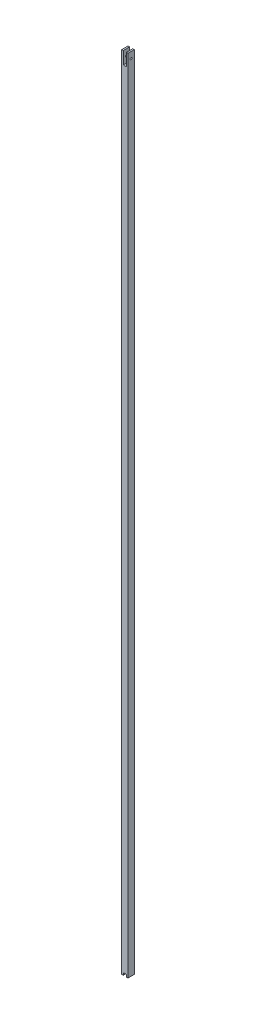
ISO-10303-21;
HEADER;
FILE_DESCRIPTION(('STEP AP214'),'2;1');
FILE_NAME('part.step','',(''),(''),'','','');
FILE_SCHEMA(('AUTOMOTIVE_DESIGN { 1 0 10303 214 1 1 1 1 }'));
ENDSEC;
DATA;
#1=APPLICATION_CONTEXT('core data for automotive mechanical design processes');
#2=APPLICATION_PROTOCOL_DEFINITION('international standard','automotive_design',2000,#1);
#3=PRODUCT_CONTEXT('',#1,'mechanical');
#4=PRODUCT('Part','Part','',(#3));
#5=PRODUCT_RELATED_PRODUCT_CATEGORY('part','',(#4));
#6=PRODUCT_DEFINITION_FORMATION('','',#4);
#7=PRODUCT_DEFINITION_CONTEXT('part definition',#1,'design');
#8=PRODUCT_DEFINITION('design','',#6,#7);
#9=PRODUCT_DEFINITION_SHAPE('','',#8);
#10=(LENGTH_UNIT() NAMED_UNIT(*) SI_UNIT(.MILLI.,.METRE.));
#11=(NAMED_UNIT(*) PLANE_ANGLE_UNIT() SI_UNIT($,.RADIAN.));
#12=(NAMED_UNIT(*) SI_UNIT($,.STERADIAN.) SOLID_ANGLE_UNIT());
#13=UNCERTAINTY_MEASURE_WITH_UNIT(LENGTH_MEASURE(1.E-05),#10,'distance_accuracy_value','');
#14=(GEOMETRIC_REPRESENTATION_CONTEXT(3) GLOBAL_UNCERTAINTY_ASSIGNED_CONTEXT((#13)) GLOBAL_UNIT_ASSIGNED_CONTEXT((#10,
#11,#12)) REPRESENTATION_CONTEXT('',''));
#15=CARTESIAN_POINT('',(0.,0.,0.));
#16=DIRECTION('',(0.,0.,1.));
#17=DIRECTION('',(1.,0.,0.));
#18=AXIS2_PLACEMENT_3D('',#15,#16,#17);
#19=CARTESIAN_POINT('',(0.,812.8,6.35));
#20=DIRECTION('',(1.,0.,0.));
#21=DIRECTION('',(0.,0.,-1.));
#22=AXIS2_PLACEMENT_3D('',#19,#20,#21);
#23=PLANE('',#22);
#24=CARTESIAN_POINT('',(0.,806.45,3.175));
#25=DIRECTION('',(1.,0.,0.));
#26=DIRECTION('',(0.,0.,-1.));
#27=AXIS2_PLACEMENT_3D('',#24,#25,#26);
#28=CIRCLE('',#27,1.);
#29=CARTESIAN_POINT('',(0.,806.45,2.175));
#30=VERTEX_POINT('',#29);
#31=EDGE_CURVE('E167',#30,#30,#28,.T.);
#32=ORIENTED_EDGE('',*,*,#31,.T.);
#33=EDGE_LOOP('',(#32));
#34=FACE_BOUND('',#33,.T.);
#35=DIRECTION('',(0.,-1.,0.));
#36=VECTOR('',#35,1.);
#37=CARTESIAN_POINT('',(0.,812.8,0.));
#38=LINE('',#37,#36);
#39=CARTESIAN_POINT('',(0.,812.8,0.));
#40=VERTEX_POINT('',#39);
#41=CARTESIAN_POINT('',(0.,0.,0.));
#42=VERTEX_POINT('',#41);
#43=EDGE_CURVE('E165',#40,#42,#38,.T.);
#44=ORIENTED_EDGE('',*,*,#43,.T.);
#45=DIRECTION('',(0.,0.,-1.));
#46=VECTOR('',#45,1.);
#47=CARTESIAN_POINT('',(0.,0.,6.35));
#48=LINE('',#47,#46);
#49=CARTESIAN_POINT('',(0.,0.,6.35));
#50=VERTEX_POINT('',#49);
#51=EDGE_CURVE('E11',#50,#42,#48,.T.);
#52=ORIENTED_EDGE('',*,*,#51,.F.);
#53=DIRECTION('',(0.,-1.,0.));
#54=VECTOR('',#53,1.);
#55=CARTESIAN_POINT('',(0.,812.8,6.35));
#56=LINE('',#55,#54);
#57=CARTESIAN_POINT('',(0.,812.8,6.35));
#58=VERTEX_POINT('',#57);
#59=EDGE_CURVE('E183',#58,#50,#56,.T.);
#60=ORIENTED_EDGE('',*,*,#59,.F.);
#61=DIRECTION('',(0.,0.,-1.));
#62=VECTOR('',#61,1.);
#63=CARTESIAN_POINT('',(0.,812.8,6.35));
#64=LINE('',#63,#62);
#65=EDGE_CURVE('E158',#58,#40,#64,.T.);
#66=ORIENTED_EDGE('',*,*,#65,.T.);
#67=EDGE_LOOP('',(#44,#52,#60,#66));
#68=FACE_BOUND('',#67,.T.);
#69=ADVANCED_FACE('F41',(#34,#68),#23,.F.);
#70=CARTESIAN_POINT('',(0.,0.,6.35));
#71=DIRECTION('',(0.,1.,0.));
#72=DIRECTION('',(0.,0.,1.));
#73=AXIS2_PLACEMENT_3D('',#70,#71,#72);
#74=PLANE('',#73);
#75=DIRECTION('',(1.,0.,0.));
#76=VECTOR('',#75,1.);
#77=CARTESIAN_POINT('',(0.,0.,0.));
#78=LINE('',#77,#76);
#79=CARTESIAN_POINT('',(1.5875,0.,0.));
#80=VERTEX_POINT('',#79);
#81=EDGE_CURVE('E164',#42,#80,#78,.T.);
#82=ORIENTED_EDGE('',*,*,#81,.T.);
#83=DIRECTION('',(0.,0.,-1.));
#84=VECTOR('',#83,1.);
#85=CARTESIAN_POINT('',(1.5875,0.,6.35));
#86=LINE('',#85,#84);
#87=CARTESIAN_POINT('',(1.5875,0.,6.35));
#88=VERTEX_POINT('',#87);
#89=EDGE_CURVE('E49',#88,#80,#86,.T.);
#90=ORIENTED_EDGE('',*,*,#89,.F.);
#91=DIRECTION('',(1.,0.,0.));
#92=VECTOR('',#91,1.);
#93=CARTESIAN_POINT('',(0.,0.,6.35));
#94=LINE('',#93,#92);
#95=EDGE_CURVE('E114',#50,#88,#94,.T.);
#96=ORIENTED_EDGE('',*,*,#95,.F.);
#97=ORIENTED_EDGE('',*,*,#51,.T.);
#98=EDGE_LOOP('',(#82,#90,#96,#97));
#99=FACE_BOUND('',#98,.T.);
#100=ADVANCED_FACE('F266',(#99),#74,.F.);
#101=CARTESIAN_POINT('',(1.5875,0.,6.35));
#102=DIRECTION('',(-1.,0.,0.));
#103=DIRECTION('',(0.,0.,1.));
#104=AXIS2_PLACEMENT_3D('',#101,#102,#103);
#105=PLANE('',#104);
#106=DIRECTION('',(0.,1.,0.));
#107=VECTOR('',#106,1.);
#108=CARTESIAN_POINT('',(1.5875,0.,0.));
#109=LINE('',#108,#107);
#110=CARTESIAN_POINT('',(1.5875,2.38125,0.));
#111=VERTEX_POINT('',#110);
#112=EDGE_CURVE('E169',#80,#111,#109,.T.);
#113=ORIENTED_EDGE('',*,*,#112,.T.);
#114=DIRECTION('',(0.,0.,-1.));
#115=VECTOR('',#114,1.);
#116=CARTESIAN_POINT('',(1.5875,2.38125,6.35));
#117=LINE('',#116,#115);
#118=CARTESIAN_POINT('',(1.5875,2.38125,6.35));
#119=VERTEX_POINT('',#118);
#120=EDGE_CURVE('E204',#119,#111,#117,.T.);
#121=ORIENTED_EDGE('',*,*,#120,.F.);
#122=DIRECTION('',(0.,1.,0.));
#123=VECTOR('',#122,1.);
#124=CARTESIAN_POINT('',(1.5875,0.,6.35));
#125=LINE('',#124,#123);
#126=EDGE_CURVE('E213',#88,#119,#125,.T.);
#127=ORIENTED_EDGE('',*,*,#126,.F.);
#128=ORIENTED_EDGE('',*,*,#89,.T.);
#129=EDGE_LOOP('',(#113,#121,#127,#128));
#130=FACE_BOUND('',#129,.T.);
#131=ADVANCED_FACE('F211',(#130),#105,.F.);
#132=CARTESIAN_POINT('',(1.5875,2.38125,6.35));
#133=DIRECTION('',(0.,1.,0.));
#134=DIRECTION('',(0.,0.,1.));
#135=AXIS2_PLACEMENT_3D('',#132,#133,#134);
#136=PLANE('',#135);
#137=DIRECTION('',(1.,0.,0.));
#138=VECTOR('',#137,1.);
#139=CARTESIAN_POINT('',(1.5875,2.38125,0.));
#140=LINE('',#139,#138);
#141=CARTESIAN_POINT('',(4.7625,2.38125,0.));
#142=VERTEX_POINT('',#141);
#143=EDGE_CURVE('E168',#111,#142,#140,.T.);
#144=ORIENTED_EDGE('',*,*,#143,.T.);
#145=DIRECTION('',(0.,0.,-1.));
#146=VECTOR('',#145,1.);
#147=CARTESIAN_POINT('',(4.7625,2.38125,6.35));
#148=LINE('',#147,#146);
#149=CARTESIAN_POINT('',(4.7625,2.38125,6.35));
#150=VERTEX_POINT('',#149);
#151=EDGE_CURVE('E203',#150,#142,#148,.T.);
#152=ORIENTED_EDGE('',*,*,#151,.F.);
#153=DIRECTION('',(1.,0.,0.));
#154=VECTOR('',#153,1.);
#155=CARTESIAN_POINT('',(1.5875,2.38125,6.35));
#156=LINE('',#155,#154);
#157=EDGE_CURVE('E233',#119,#150,#156,.T.);
#158=ORIENTED_EDGE('',*,*,#157,.F.);
#159=ORIENTED_EDGE('',*,*,#120,.T.);
#160=EDGE_LOOP('',(#144,#152,#158,#159));
#161=FACE_BOUND('',#160,.T.);
#162=ADVANCED_FACE('F225',(#161),#136,.F.);
#163=CARTESIAN_POINT('',(4.7625,2.38125,6.35));
#164=DIRECTION('',(1.,0.,0.));
#165=DIRECTION('',(0.,0.,-1.));
#166=AXIS2_PLACEMENT_3D('',#163,#164,#165);
#167=PLANE('',#166);
#168=DIRECTION('',(0.,-1.,0.));
#169=VECTOR('',#168,1.);
#170=CARTESIAN_POINT('',(4.7625,2.38125,0.));
#171=LINE('',#170,#169);
#172=CARTESIAN_POINT('',(4.7625,0.,0.));
#173=VERTEX_POINT('',#172);
#174=EDGE_CURVE('E174',#142,#173,#171,.T.);
#175=ORIENTED_EDGE('',*,*,#174,.T.);
#176=DIRECTION('',(0.,0.,-1.));
#177=VECTOR('',#176,1.);
#178=CARTESIAN_POINT('',(4.7625,0.,6.35));
#179=LINE('',#178,#177);
#180=CARTESIAN_POINT('',(4.7625,0.,6.35));
#181=VERTEX_POINT('',#180);
#182=EDGE_CURVE('E196',#181,#173,#179,.T.);
#183=ORIENTED_EDGE('',*,*,#182,.F.);
#184=DIRECTION('',(0.,-1.,0.));
#185=VECTOR('',#184,1.);
#186=CARTESIAN_POINT('',(4.7625,2.38125,6.35));
#187=LINE('',#186,#185);
#188=EDGE_CURVE('E227',#150,#181,#187,.T.);
#189=ORIENTED_EDGE('',*,*,#188,.F.);
#190=ORIENTED_EDGE('',*,*,#151,.T.);
#191=EDGE_LOOP('',(#175,#183,#189,#190));
#192=FACE_BOUND('',#191,.T.);
#193=ADVANCED_FACE('F228',(#192),#167,.F.);
#194=CARTESIAN_POINT('',(4.7625,0.,6.35));
#195=DIRECTION('',(0.,1.,0.));
#196=DIRECTION('',(0.,0.,1.));
#197=AXIS2_PLACEMENT_3D('',#194,#195,#196);
#198=PLANE('',#197);
#199=DIRECTION('',(1.,0.,0.));
#200=VECTOR('',#199,1.);
#201=CARTESIAN_POINT('',(4.7625,0.,0.));
#202=LINE('',#201,#200);
#203=CARTESIAN_POINT('',(6.35,0.,0.));
#204=VERTEX_POINT('',#203);
#205=EDGE_CURVE('E175',#173,#204,#202,.T.);
#206=ORIENTED_EDGE('',*,*,#205,.T.);
#207=DIRECTION('',(0.,0.,-1.));
#208=VECTOR('',#207,1.);
#209=CARTESIAN_POINT('',(6.35,0.,6.35));
#210=LINE('',#209,#208);
#211=CARTESIAN_POINT('',(6.35,0.,6.35));
#212=VERTEX_POINT('',#211);
#213=EDGE_CURVE('E191',#212,#204,#210,.T.);
#214=ORIENTED_EDGE('',*,*,#213,.F.);
#215=DIRECTION('',(1.,0.,0.));
#216=VECTOR('',#215,1.);
#217=CARTESIAN_POINT('',(4.7625,0.,6.35));
#218=LINE('',#217,#216);
#219=EDGE_CURVE('E226',#181,#212,#218,.T.);
#220=ORIENTED_EDGE('',*,*,#219,.F.);
#221=ORIENTED_EDGE('',*,*,#182,.T.);
#222=EDGE_LOOP('',(#206,#214,#220,#221));
#223=FACE_BOUND('',#222,.T.);
#224=ADVANCED_FACE('F349',(#223),#198,.F.);
#225=CARTESIAN_POINT('',(6.35,0.,6.35));
#226=DIRECTION('',(-1.,0.,0.));
#227=DIRECTION('',(0.,0.,1.));
#228=AXIS2_PLACEMENT_3D('',#225,#226,#227);
#229=PLANE('',#228);
#230=CARTESIAN_POINT('',(6.35,806.45,3.175));
#231=DIRECTION('',(-1.,0.,0.));
#232=DIRECTION('',(0.,0.,1.));
#233=AXIS2_PLACEMENT_3D('',#230,#231,#232);
#234=CIRCLE('',#233,1.);
#235=CARTESIAN_POINT('',(6.35,806.45,4.175));
#236=VERTEX_POINT('',#235);
#237=EDGE_CURVE('E277',#236,#236,#234,.T.);
#238=ORIENTED_EDGE('',*,*,#237,.T.);
#239=EDGE_LOOP('',(#238));
#240=FACE_BOUND('',#239,.T.);
#241=DIRECTION('',(0.,1.,0.));
#242=VECTOR('',#241,1.);
#243=CARTESIAN_POINT('',(6.35,0.,0.));
#244=LINE('',#243,#242);
#245=CARTESIAN_POINT('',(6.35,812.8,0.));
#246=VERTEX_POINT('',#245);
#247=EDGE_CURVE('E178',#204,#246,#244,.T.);
#248=ORIENTED_EDGE('',*,*,#247,.T.);
#249=DIRECTION('',(0.,0.,-1.));
#250=VECTOR('',#249,1.);
#251=CARTESIAN_POINT('',(6.35,812.8,6.35));
#252=LINE('',#251,#250);
#253=CARTESIAN_POINT('',(6.35,812.8,6.35));
#254=VERTEX_POINT('',#253);
#255=EDGE_CURVE('E194',#254,#246,#252,.T.);
#256=ORIENTED_EDGE('',*,*,#255,.F.);
#257=DIRECTION('',(0.,1.,0.));
#258=VECTOR('',#257,1.);
#259=CARTESIAN_POINT('',(6.35,0.,6.35));
#260=LINE('',#259,#258);
#261=EDGE_CURVE('E232',#212,#254,#260,.T.);
#262=ORIENTED_EDGE('',*,*,#261,.F.);
#263=ORIENTED_EDGE('',*,*,#213,.T.);
#264=EDGE_LOOP('',(#248,#256,#262,#263));
#265=FACE_BOUND('',#264,.T.);
#266=ADVANCED_FACE('F336',(#240,#265),#229,.F.);
#267=CARTESIAN_POINT('',(6.35,812.8,6.35));
#268=DIRECTION('',(0.,-1.,0.));
#269=DIRECTION('',(0.,0.,-1.));
#270=AXIS2_PLACEMENT_3D('',#267,#268,#269);
#271=PLANE('',#270);
#272=DIRECTION('',(-1.,0.,0.));
#273=VECTOR('',#272,1.);
#274=CARTESIAN_POINT('',(6.35,812.8,0.));
#275=LINE('',#274,#273);
#276=CARTESIAN_POINT('',(4.7625,812.8,0.));
#277=VERTEX_POINT('',#276);
#278=EDGE_CURVE('E177',#246,#277,#275,.T.);
#279=ORIENTED_EDGE('',*,*,#278,.T.);
#280=DIRECTION('',(0.,0.,-1.));
#281=VECTOR('',#280,1.);
#282=CARTESIAN_POINT('',(4.7625,812.8,6.35));
#283=LINE('',#282,#281);
#284=CARTESIAN_POINT('',(4.7625,812.8,6.35));
#285=VERTEX_POINT('',#284);
#286=EDGE_CURVE('E190',#285,#277,#283,.T.);
#287=ORIENTED_EDGE('',*,*,#286,.F.);
#288=DIRECTION('',(-1.,0.,0.));
#289=VECTOR('',#288,1.);
#290=CARTESIAN_POINT('',(6.35,812.8,6.35));
#291=LINE('',#290,#289);
#292=EDGE_CURVE('E239',#254,#285,#291,.T.);
#293=ORIENTED_EDGE('',*,*,#292,.F.);
#294=ORIENTED_EDGE('',*,*,#255,.T.);
#295=EDGE_LOOP('',(#279,#287,#293,#294));
#296=FACE_BOUND('',#295,.T.);
#297=ADVANCED_FACE('F241',(#296),#271,.F.);
#298=CARTESIAN_POINT('',(4.7625,812.8,6.35));
#299=DIRECTION('',(1.,0.,0.));
#300=DIRECTION('',(0.,0.,-1.));
#301=AXIS2_PLACEMENT_3D('',#298,#299,#300);
#302=PLANE('',#301);
#303=CARTESIAN_POINT('',(4.7625,806.45,3.175));
#304=DIRECTION('',(1.,0.,0.));
#305=DIRECTION('',(0.,0.,-1.));
#306=AXIS2_PLACEMENT_3D('',#303,#304,#305);
#307=CIRCLE('',#306,1.);
#308=CARTESIAN_POINT('',(4.7625,806.45,2.175));
#309=VERTEX_POINT('',#308);
#310=EDGE_CURVE('E276',#309,#309,#307,.T.);
#311=ORIENTED_EDGE('',*,*,#310,.T.);
#312=EDGE_LOOP('',(#311));
#313=FACE_BOUND('',#312,.T.);
#314=DIRECTION('',(0.,-1.,0.));
#315=VECTOR('',#314,1.);
#316=CARTESIAN_POINT('',(4.7625,812.8,0.));
#317=LINE('',#316,#315);
#318=CARTESIAN_POINT('',(4.7625,800.1,0.));
#319=VERTEX_POINT('',#318);
#320=EDGE_CURVE('E176',#277,#319,#317,.T.);
#321=ORIENTED_EDGE('',*,*,#320,.T.);
#322=DIRECTION('',(0.,0.,-1.));
#323=VECTOR('',#322,1.);
#324=CARTESIAN_POINT('',(4.7625,800.1,6.35));
#325=LINE('',#324,#323);
#326=CARTESIAN_POINT('',(4.7625,800.1,6.35));
#327=VERTEX_POINT('',#326);
#328=EDGE_CURVE('E153',#327,#319,#325,.T.);
#329=ORIENTED_EDGE('',*,*,#328,.F.);
#330=DIRECTION('',(0.,-1.,0.));
#331=VECTOR('',#330,1.);
#332=CARTESIAN_POINT('',(4.7625,812.8,6.35));
#333=LINE('',#332,#331);
#334=EDGE_CURVE('E145',#285,#327,#333,.T.);
#335=ORIENTED_EDGE('',*,*,#334,.F.);
#336=ORIENTED_EDGE('',*,*,#286,.T.);
#337=EDGE_LOOP('',(#321,#329,#335,#336));
#338=FACE_BOUND('',#337,.T.);
#339=ADVANCED_FACE('F250',(#313,#338),#302,.F.);
#340=CARTESIAN_POINT('',(4.7625,800.1,6.35));
#341=DIRECTION('',(0.,-1.,0.));
#342=DIRECTION('',(0.,0.,-1.));
#343=AXIS2_PLACEMENT_3D('',#340,#341,#342);
#344=PLANE('',#343);
#345=DIRECTION('',(-1.,0.,0.));
#346=VECTOR('',#345,1.);
#347=CARTESIAN_POINT('',(4.7625,800.1,0.));
#348=LINE('',#347,#346);
#349=CARTESIAN_POINT('',(1.5875,800.1,0.));
#350=VERTEX_POINT('',#349);
#351=EDGE_CURVE('E155',#319,#350,#348,.T.);
#352=ORIENTED_EDGE('',*,*,#351,.T.);
#353=DIRECTION('',(0.,0.,-1.));
#354=VECTOR('',#353,1.);
#355=CARTESIAN_POINT('',(1.5875,800.1,6.35));
#356=LINE('',#355,#354);
#357=CARTESIAN_POINT('',(1.5875,800.1,6.35));
#358=VERTEX_POINT('',#357);
#359=EDGE_CURVE('E149',#358,#350,#356,.T.);
#360=ORIENTED_EDGE('',*,*,#359,.F.);
#361=DIRECTION('',(-1.,0.,0.));
#362=VECTOR('',#361,1.);
#363=CARTESIAN_POINT('',(4.7625,800.1,6.35));
#364=LINE('',#363,#362);
#365=EDGE_CURVE('E137',#327,#358,#364,.T.);
#366=ORIENTED_EDGE('',*,*,#365,.F.);
#367=ORIENTED_EDGE('',*,*,#328,.T.);
#368=EDGE_LOOP('',(#352,#360,#366,#367));
#369=FACE_BOUND('',#368,.T.);
#370=ADVANCED_FACE('F147',(#369),#344,.F.);
#371=CARTESIAN_POINT('',(1.5875,800.1,6.35));
#372=DIRECTION('',(-1.,0.,0.));
#373=DIRECTION('',(0.,0.,1.));
#374=AXIS2_PLACEMENT_3D('',#371,#372,#373);
#375=PLANE('',#374);
#376=CARTESIAN_POINT('',(1.5875,806.45,3.175));
#377=DIRECTION('',(-1.,0.,0.));
#378=DIRECTION('',(0.,0.,1.));
#379=AXIS2_PLACEMENT_3D('',#376,#377,#378);
#380=CIRCLE('',#379,1.);
#381=CARTESIAN_POINT('',(1.5875,806.45,4.175));
#382=VERTEX_POINT('',#381);
#383=EDGE_CURVE('E42',#382,#382,#380,.T.);
#384=ORIENTED_EDGE('',*,*,#383,.T.);
#385=EDGE_LOOP('',(#384));
#386=FACE_BOUND('',#385,.T.);
#387=DIRECTION('',(0.,1.,0.));
#388=VECTOR('',#387,1.);
#389=CARTESIAN_POINT('',(1.5875,800.1,0.));
#390=LINE('',#389,#388);
#391=CARTESIAN_POINT('',(1.5875,812.8,0.));
#392=VERTEX_POINT('',#391);
#393=EDGE_CURVE('E97',#350,#392,#390,.T.);
#394=ORIENTED_EDGE('',*,*,#393,.T.);
#395=DIRECTION('',(0.,0.,-1.));
#396=VECTOR('',#395,1.);
#397=CARTESIAN_POINT('',(1.5875,812.8,6.35));
#398=LINE('',#397,#396);
#399=CARTESIAN_POINT('',(1.5875,812.8,6.35));
#400=VERTEX_POINT('',#399);
#401=EDGE_CURVE('E152',#400,#392,#398,.T.);
#402=ORIENTED_EDGE('',*,*,#401,.F.);
#403=DIRECTION('',(0.,1.,0.));
#404=VECTOR('',#403,1.);
#405=CARTESIAN_POINT('',(1.5875,800.1,6.35));
#406=LINE('',#405,#404);
#407=EDGE_CURVE('E142',#358,#400,#406,.T.);
#408=ORIENTED_EDGE('',*,*,#407,.F.);
#409=ORIENTED_EDGE('',*,*,#359,.T.);
#410=EDGE_LOOP('',(#394,#402,#408,#409));
#411=FACE_BOUND('',#410,.T.);
#412=ADVANCED_FACE('F156',(#386,#411),#375,.F.);
#413=CARTESIAN_POINT('',(1.5875,812.8,6.35));
#414=DIRECTION('',(0.,-1.,0.));
#415=DIRECTION('',(0.,0.,-1.));
#416=AXIS2_PLACEMENT_3D('',#413,#414,#415);
#417=PLANE('',#416);
#418=DIRECTION('',(-1.,0.,0.));
#419=VECTOR('',#418,1.);
#420=CARTESIAN_POINT('',(1.5875,812.8,0.));
#421=LINE('',#420,#419);
#422=EDGE_CURVE('E104',#392,#40,#421,.T.);
#423=ORIENTED_EDGE('',*,*,#422,.T.);
#424=ORIENTED_EDGE('',*,*,#65,.F.);
#425=DIRECTION('',(-1.,0.,0.));
#426=VECTOR('',#425,1.);
#427=CARTESIAN_POINT('',(1.5875,812.8,6.35));
#428=LINE('',#427,#426);
#429=EDGE_CURVE('E59',#400,#58,#428,.T.);
#430=ORIENTED_EDGE('',*,*,#429,.F.);
#431=ORIENTED_EDGE('',*,*,#401,.T.);
#432=EDGE_LOOP('',(#423,#424,#430,#431));
#433=FACE_BOUND('',#432,.T.);
#434=ADVANCED_FACE('F251',(#433),#417,.F.);
#435=CARTESIAN_POINT('',(0.,0.,6.35));
#436=DIRECTION('',(0.,0.,1.));
#437=DIRECTION('',(1.,0.,0.));
#438=AXIS2_PLACEMENT_3D('',#435,#436,#437);
#439=PLANE('',#438);
#440=ORIENTED_EDGE('',*,*,#59,.T.);
#441=ORIENTED_EDGE('',*,*,#95,.T.);
#442=ORIENTED_EDGE('',*,*,#126,.T.);
#443=ORIENTED_EDGE('',*,*,#157,.T.);
#444=ORIENTED_EDGE('',*,*,#188,.T.);
#445=ORIENTED_EDGE('',*,*,#219,.T.);
#446=ORIENTED_EDGE('',*,*,#261,.T.);
#447=ORIENTED_EDGE('',*,*,#292,.T.);
#448=ORIENTED_EDGE('',*,*,#334,.T.);
#449=ORIENTED_EDGE('',*,*,#365,.T.);
#450=ORIENTED_EDGE('',*,*,#407,.T.);
#451=ORIENTED_EDGE('',*,*,#429,.T.);
#452=EDGE_LOOP('',(#440,#441,#442,#443,#444,#445,#446,#447,#448,#449,#450,#451));
#453=FACE_BOUND('',#452,.T.);
#454=ADVANCED_FACE('F136',(#453),#439,.T.);
#455=CARTESIAN_POINT('',(0.,0.,0.));
#456=DIRECTION('',(0.,0.,1.));
#457=DIRECTION('',(1.,0.,0.));
#458=AXIS2_PLACEMENT_3D('',#455,#456,#457);
#459=PLANE('',#458);
#460=ORIENTED_EDGE('',*,*,#43,.F.);
#461=ORIENTED_EDGE('',*,*,#422,.F.);
#462=ORIENTED_EDGE('',*,*,#393,.F.);
#463=ORIENTED_EDGE('',*,*,#351,.F.);
#464=ORIENTED_EDGE('',*,*,#320,.F.);
#465=ORIENTED_EDGE('',*,*,#278,.F.);
#466=ORIENTED_EDGE('',*,*,#247,.F.);
#467=ORIENTED_EDGE('',*,*,#205,.F.);
#468=ORIENTED_EDGE('',*,*,#174,.F.);
#469=ORIENTED_EDGE('',*,*,#143,.F.);
#470=ORIENTED_EDGE('',*,*,#112,.F.);
#471=ORIENTED_EDGE('',*,*,#81,.F.);
#472=EDGE_LOOP('',(#460,#461,#462,#463,#464,#465,#466,#467,#468,#469,#470,#471));
#473=FACE_BOUND('',#472,.T.);
#474=ADVANCED_FACE('F220',(#473),#459,.F.);
#475=CARTESIAN_POINT('',(-10.,806.45,3.175));
#476=DIRECTION('',(1.,0.,0.));
#477=DIRECTION('',(0.,0.,-1.));
#478=AXIS2_PLACEMENT_3D('',#475,#476,#477);
#479=CYLINDRICAL_SURFACE('',#478,1.);
#480=ORIENTED_EDGE('',*,*,#383,.F.);
#481=EDGE_LOOP('',(#480));
#482=FACE_BOUND('',#481,.T.);
#483=ORIENTED_EDGE('',*,*,#31,.F.);
#484=EDGE_LOOP('',(#483));
#485=FACE_BOUND('',#484,.T.);
#486=ADVANCED_FACE('F286',(#482,#485),#479,.F.);
#487=ORIENTED_EDGE('',*,*,#310,.F.);
#488=EDGE_LOOP('',(#487));
#489=FACE_BOUND('',#488,.T.);
#490=ORIENTED_EDGE('',*,*,#237,.F.);
#491=EDGE_LOOP('',(#490));
#492=FACE_BOUND('',#491,.T.);
#493=ADVANCED_FACE('F295',(#489,#492),#479,.F.);
#494=CLOSED_SHELL('',(#69,#100,#131,#162,#193,#224,#266,#297,#339,#370,#412,#434,#454,#474,#486,#493));
#495=MANIFOLD_SOLID_BREP('B2',#494);
#496=ADVANCED_BREP_SHAPE_REPRESENTATION('',(#18,#495),#14);
#497=SHAPE_DEFINITION_REPRESENTATION(#9,#496);
ENDSEC;
END-ISO-10303-21;
